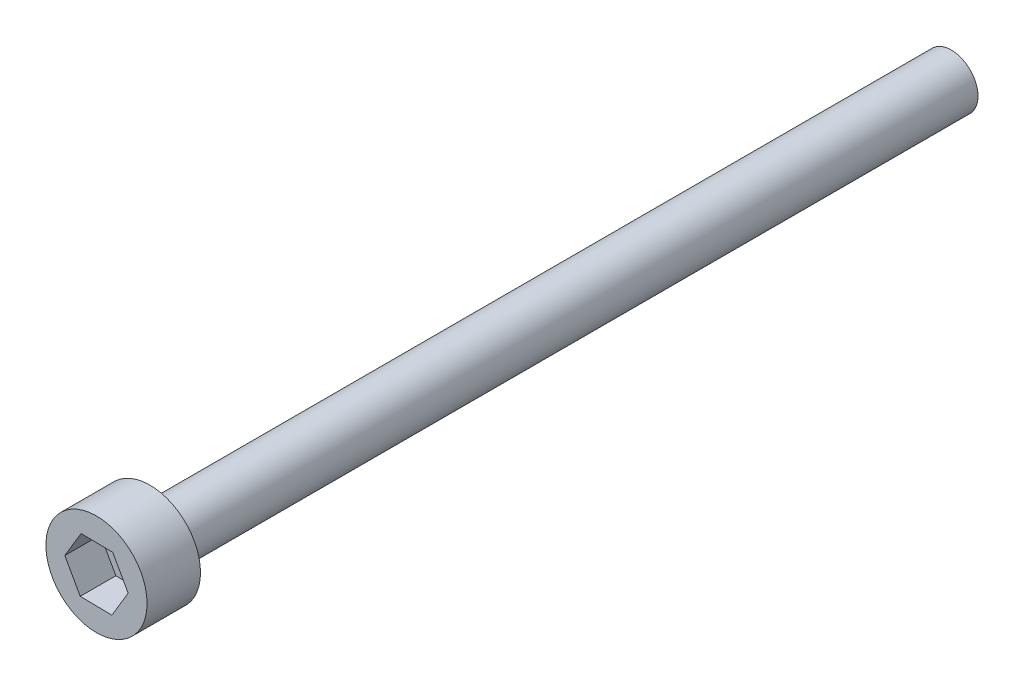
ISO-10303-21;
HEADER;
FILE_DESCRIPTION(('STEP AP214'),'2;1');
FILE_NAME('part.step','',(''),(''),'','','');
FILE_SCHEMA(('AUTOMOTIVE_DESIGN { 1 0 10303 214 1 1 1 1 }'));
ENDSEC;
DATA;
#1=APPLICATION_CONTEXT('core data for automotive mechanical design processes');
#2=APPLICATION_PROTOCOL_DEFINITION('international standard','automotive_design',2000,#1);
#3=PRODUCT_CONTEXT('',#1,'mechanical');
#4=PRODUCT('Part','Part','',(#3));
#5=PRODUCT_RELATED_PRODUCT_CATEGORY('part','',(#4));
#6=PRODUCT_DEFINITION_FORMATION('','',#4);
#7=PRODUCT_DEFINITION_CONTEXT('part definition',#1,'design');
#8=PRODUCT_DEFINITION('design','',#6,#7);
#9=PRODUCT_DEFINITION_SHAPE('','',#8);
#10=(LENGTH_UNIT() NAMED_UNIT(*) SI_UNIT(.MILLI.,.METRE.));
#11=(NAMED_UNIT(*) PLANE_ANGLE_UNIT() SI_UNIT($,.RADIAN.));
#12=(NAMED_UNIT(*) SI_UNIT($,.STERADIAN.) SOLID_ANGLE_UNIT());
#13=UNCERTAINTY_MEASURE_WITH_UNIT(LENGTH_MEASURE(1.E-05),#10,'distance_accuracy_value','');
#14=(GEOMETRIC_REPRESENTATION_CONTEXT(3) GLOBAL_UNCERTAINTY_ASSIGNED_CONTEXT((#13)) GLOBAL_UNIT_ASSIGNED_CONTEXT((#10,
#11,#12)) REPRESENTATION_CONTEXT('',''));
#15=CARTESIAN_POINT('',(0.,0.,0.));
#16=DIRECTION('',(0.,0.,1.));
#17=DIRECTION('',(1.,0.,0.));
#18=AXIS2_PLACEMENT_3D('',#15,#16,#17);
#19=CARTESIAN_POINT('',(0.,0.,3.));
#20=DIRECTION('',(0.,0.,-1.));
#21=DIRECTION('',(-1.,0.,0.));
#22=AXIS2_PLACEMENT_3D('',#19,#20,#21);
#23=CYLINDRICAL_SURFACE('',#22,2.84);
#24=CARTESIAN_POINT('',(0.,0.,3.));
#25=DIRECTION('',(0.,0.,1.));
#26=DIRECTION('',(1.,0.,0.));
#27=AXIS2_PLACEMENT_3D('',#24,#25,#26);
#28=CIRCLE('',#27,2.84);
#29=CARTESIAN_POINT('',(2.84,0.,3.));
#30=VERTEX_POINT('',#29);
#31=EDGE_CURVE('E44',#30,#30,#28,.T.);
#32=ORIENTED_EDGE('',*,*,#31,.F.);
#33=EDGE_LOOP('',(#32));
#34=FACE_BOUND('',#33,.T.);
#35=CARTESIAN_POINT('',(0.,0.,0.));
#36=DIRECTION('',(0.,0.,1.));
#37=DIRECTION('',(1.,0.,0.));
#38=AXIS2_PLACEMENT_3D('',#35,#36,#37);
#39=CIRCLE('',#38,2.84);
#40=CARTESIAN_POINT('',(2.84,0.,0.));
#41=VERTEX_POINT('',#40);
#42=EDGE_CURVE('E146',#41,#41,#39,.T.);
#43=ORIENTED_EDGE('',*,*,#42,.T.);
#44=EDGE_LOOP('',(#43));
#45=FACE_BOUND('',#44,.T.);
#46=ADVANCED_FACE('F37',(#34,#45),#23,.T.);
#47=CARTESIAN_POINT('',(0.,0.,3.));
#48=DIRECTION('',(0.,0.,1.));
#49=DIRECTION('',(1.,0.,0.));
#50=AXIS2_PLACEMENT_3D('',#47,#48,#49);
#51=PLANE('',#50);
#52=DIRECTION('',(-0.486688945822522,0.873575337343129,0.));
#53=VECTOR('',#52,1.);
#54=CARTESIAN_POINT('',(1.77803061008708,-0.027211815938925,3.));
#55=LINE('',#54,#53);
#56=CARTESIAN_POINT('',(1.77803061008708,-0.027211815938925,3.));
#57=VERTEX_POINT('',#56);
#58=CARTESIAN_POINT('',(0.912581428929756,1.52621376907229,3.));
#59=VERTEX_POINT('',#58);
#60=EDGE_CURVE('E51',#57,#59,#55,.T.);
#61=ORIENTED_EDGE('',*,*,#60,.F.);
#62=DIRECTION('',(0.513193961347449,0.858272659494937,0.));
#63=VECTOR('',#62,1.);
#64=CARTESIAN_POINT('',(0.865449181157325,-1.55342558501122,3.));
#65=LINE('',#64,#63);
#66=CARTESIAN_POINT('',(0.865449181157325,-1.55342558501122,3.));
#67=VERTEX_POINT('',#66);
#68=EDGE_CURVE('E134',#67,#57,#65,.T.);
#69=ORIENTED_EDGE('',*,*,#68,.F.);
#70=DIRECTION('',(0.999882907169972,-0.0153026778481919,0.));
#71=VECTOR('',#70,1.);
#72=CARTESIAN_POINT('',(-0.912581428929756,-1.52621376907229,3.));
#73=LINE('',#72,#71);
#74=CARTESIAN_POINT('',(-0.912581428929756,-1.52621376907229,3.));
#75=VERTEX_POINT('',#74);
#76=EDGE_CURVE('E132',#75,#67,#73,.T.);
#77=ORIENTED_EDGE('',*,*,#76,.F.);
#78=DIRECTION('',(0.486688945822522,-0.873575337343129,0.));
#79=VECTOR('',#78,1.);
#80=CARTESIAN_POINT('',(-1.77803061008708,0.0272118159389248,3.));
#81=LINE('',#80,#79);
#82=CARTESIAN_POINT('',(-1.77803061008708,0.0272118159389248,3.));
#83=VERTEX_POINT('',#82);
#84=EDGE_CURVE('E99',#83,#75,#81,.T.);
#85=ORIENTED_EDGE('',*,*,#84,.F.);
#86=DIRECTION('',(-0.513193961347449,-0.858272659494938,0.));
#87=VECTOR('',#86,1.);
#88=CARTESIAN_POINT('',(-0.865449181157325,1.55342558501122,3.));
#89=LINE('',#88,#87);
#90=CARTESIAN_POINT('',(-0.865449181157325,1.55342558501122,3.));
#91=VERTEX_POINT('',#90);
#92=EDGE_CURVE('E128',#91,#83,#89,.T.);
#93=ORIENTED_EDGE('',*,*,#92,.F.);
#94=DIRECTION('',(-0.999882907169972,0.0153026778481919,0.));
#95=VECTOR('',#94,1.);
#96=CARTESIAN_POINT('',(0.912581428929756,1.52621376907229,3.));
#97=LINE('',#96,#95);
#98=EDGE_CURVE('E125',#59,#91,#97,.T.);
#99=ORIENTED_EDGE('',*,*,#98,.F.);
#100=EDGE_LOOP('',(#61,#69,#77,#85,#93,#99));
#101=FACE_BOUND('',#100,.T.);
#102=ORIENTED_EDGE('',*,*,#31,.T.);
#103=EDGE_LOOP('',(#102));
#104=FACE_BOUND('',#103,.T.);
#105=ADVANCED_FACE('F155',(#101,#104),#51,.T.);
#106=CARTESIAN_POINT('',(0.,0.,0.));
#107=DIRECTION('',(0.,0.,1.));
#108=DIRECTION('',(1.,0.,0.));
#109=AXIS2_PLACEMENT_3D('',#106,#107,#108);
#110=PLANE('',#109);
#111=CARTESIAN_POINT('',(0.,0.,0.));
#112=DIRECTION('',(0.,0.,1.));
#113=DIRECTION('',(1.,0.,0.));
#114=AXIS2_PLACEMENT_3D('',#111,#112,#113);
#115=CIRCLE('',#114,1.5);
#116=CARTESIAN_POINT('',(1.5,0.,0.));
#117=VERTEX_POINT('',#116);
#118=EDGE_CURVE('E11',#117,#117,#115,.F.);
#119=ORIENTED_EDGE('',*,*,#118,.F.);
#120=EDGE_LOOP('',(#119));
#121=FACE_BOUND('',#120,.T.);
#122=ORIENTED_EDGE('',*,*,#42,.F.);
#123=EDGE_LOOP('',(#122));
#124=FACE_BOUND('',#123,.T.);
#125=ADVANCED_FACE('F152',(#121,#124),#110,.F.);
#126=CARTESIAN_POINT('',(0.,0.,-45.));
#127=DIRECTION('',(0.,0.,1.));
#128=DIRECTION('',(1.,0.,0.));
#129=AXIS2_PLACEMENT_3D('',#126,#127,#128);
#130=CYLINDRICAL_SURFACE('',#129,1.5);
#131=CARTESIAN_POINT('',(0.,0.,-45.));
#132=DIRECTION('',(0.,0.,-1.));
#133=DIRECTION('',(-1.,0.,0.));
#134=AXIS2_PLACEMENT_3D('',#131,#132,#133);
#135=CIRCLE('',#134,1.5);
#136=CARTESIAN_POINT('',(1.5,0.,-45.));
#137=VERTEX_POINT('',#136);
#138=EDGE_CURVE('E138',#137,#137,#135,.T.);
#139=CARTESIAN_POINT('',(1.5,0.,-45.));
#140=CARTESIAN_POINT('',(1.5,0.,-44.53125));
#141=CARTESIAN_POINT('',(1.5,0.,-44.0625));
#142=CARTESIAN_POINT('',(1.5,0.,-43.125));
#143=CARTESIAN_POINT('',(1.5,0.,-42.65625));
#144=CARTESIAN_POINT('',(1.5,0.,-41.71875));
#145=CARTESIAN_POINT('',(1.5,0.,-41.25));
#146=CARTESIAN_POINT('',(1.5,0.,-40.3125));
#147=CARTESIAN_POINT('',(1.5,0.,-39.84375));
#148=CARTESIAN_POINT('',(1.5,0.,-38.90625));
#149=CARTESIAN_POINT('',(1.5,0.,-38.4375));
#150=CARTESIAN_POINT('',(1.5,0.,-37.5));
#151=CARTESIAN_POINT('',(1.5,0.,-37.03125));
#152=CARTESIAN_POINT('',(1.5,0.,-36.09375));
#153=CARTESIAN_POINT('',(1.5,0.,-35.625));
#154=CARTESIAN_POINT('',(1.5,0.,-34.6875));
#155=CARTESIAN_POINT('',(1.5,0.,-34.21875));
#156=CARTESIAN_POINT('',(1.5,0.,-33.28125));
#157=CARTESIAN_POINT('',(1.5,0.,-32.8125));
#158=CARTESIAN_POINT('',(1.5,0.,-31.875));
#159=CARTESIAN_POINT('',(1.5,0.,-31.40625));
#160=CARTESIAN_POINT('',(1.5,0.,-30.46875));
#161=CARTESIAN_POINT('',(1.5,0.,-30.));
#162=CARTESIAN_POINT('',(1.5,0.,-29.0625));
#163=CARTESIAN_POINT('',(1.5,0.,-28.59375));
#164=CARTESIAN_POINT('',(1.5,0.,-27.65625));
#165=CARTESIAN_POINT('',(1.5,0.,-27.1875));
#166=CARTESIAN_POINT('',(1.5,0.,-26.25));
#167=CARTESIAN_POINT('',(1.5,0.,-25.78125));
#168=CARTESIAN_POINT('',(1.5,0.,-24.84375));
#169=CARTESIAN_POINT('',(1.5,0.,-24.375));
#170=CARTESIAN_POINT('',(1.5,0.,-23.4375));
#171=CARTESIAN_POINT('',(1.5,0.,-22.96875));
#172=CARTESIAN_POINT('',(1.5,0.,-22.03125));
#173=CARTESIAN_POINT('',(1.5,0.,-21.5625));
#174=CARTESIAN_POINT('',(1.5,0.,-20.625));
#175=CARTESIAN_POINT('',(1.5,0.,-20.15625));
#176=CARTESIAN_POINT('',(1.5,0.,-19.21875));
#177=CARTESIAN_POINT('',(1.5,0.,-18.75));
#178=CARTESIAN_POINT('',(1.5,0.,-17.8125));
#179=CARTESIAN_POINT('',(1.5,0.,-17.34375));
#180=CARTESIAN_POINT('',(1.5,0.,-16.40625));
#181=CARTESIAN_POINT('',(1.5,0.,-15.9375));
#182=CARTESIAN_POINT('',(1.5,0.,-15.));
#183=CARTESIAN_POINT('',(1.5,0.,-14.53125));
#184=CARTESIAN_POINT('',(1.5,0.,-13.59375));
#185=CARTESIAN_POINT('',(1.5,0.,-13.125));
#186=CARTESIAN_POINT('',(1.5,0.,-12.1875));
#187=CARTESIAN_POINT('',(1.5,0.,-11.71875));
#188=CARTESIAN_POINT('',(1.5,0.,-10.78125));
#189=CARTESIAN_POINT('',(1.5,0.,-10.3125));
#190=CARTESIAN_POINT('',(1.5,0.,-9.37500000000001));
#191=CARTESIAN_POINT('',(1.5,0.,-8.90625000000001));
#192=CARTESIAN_POINT('',(1.5,0.,-7.96875000000001));
#193=CARTESIAN_POINT('',(1.5,0.,-7.5));
#194=CARTESIAN_POINT('',(1.5,0.,-6.5625));
#195=CARTESIAN_POINT('',(1.5,0.,-6.09375));
#196=CARTESIAN_POINT('',(1.5,0.,-5.15625000000001));
#197=CARTESIAN_POINT('',(1.5,0.,-4.68750000000001));
#198=CARTESIAN_POINT('',(1.5,0.,-3.75000000000001));
#199=CARTESIAN_POINT('',(1.5,0.,-3.28125000000001));
#200=CARTESIAN_POINT('',(1.5,0.,-2.34375000000001));
#201=CARTESIAN_POINT('',(1.5,0.,-1.87500000000001));
#202=CARTESIAN_POINT('',(1.5,0.,-0.937500000000006));
#203=CARTESIAN_POINT('',(1.5,0.,-0.468750000000007));
#204=CARTESIAN_POINT('',(1.5,0.,0.));
#205=B_SPLINE_CURVE_WITH_KNOTS('',3,(#139,#140,#141,#142,#143,#144,#145,#146,#147,#148,#149,
#150,#151,#152,#153,#154,#155,#156,#157,#158,#159,#160,#161,#162,#163,#164,#165,#166,#167,#168,
#169,#170,#171,#172,#173,#174,#175,#176,#177,#178,#179,#180,#181,#182,#183,#184,#185,#186,#187,
#188,#189,#190,#191,#192,#193,#194,#195,#196,#197,#198,#199,#200,#201,#202,#203,#204),
.UNSPECIFIED.,.F.,.F.,(4,2,2,2,2,2,2,2,2,2,2,2,2,2,2,2,2,2,2,2,2,2,2,2,2,2,2,2,2,2,2,2,4),(0.,
1.40625,2.8125,4.21874999999999,5.625,7.03125,8.43749999999999,9.84374999999999,11.25,12.65625,
14.0625,15.46875,16.875,18.28125,19.6875,21.09375,22.5,23.90625,25.3125,26.71875,28.125,
29.53125,30.9375,32.34375,33.75,35.15625,36.5625,37.96875,39.375,40.78125,42.1875,43.59375,45.),.UNSPECIFIED.);
#206=EDGE_CURVE('BSEAM154',#137,#117,#205,.T.);
#207=ORIENTED_EDGE('',*,*,#138,.F.);
#208=ORIENTED_EDGE('',*,*,#118,.T.);
#209=ORIENTED_EDGE('',*,*,#206,.T.);
#210=ORIENTED_EDGE('',*,*,#206,.F.);
#211=EDGE_LOOP('',(#207,#209,#208,#210));
#212=FACE_BOUND('',#211,.T.);
#213=ADVANCED_FACE('F154',(#212),#130,.T.);
#214=CARTESIAN_POINT('',(0.,0.,-45.));
#215=DIRECTION('',(0.,0.,-1.));
#216=DIRECTION('',(-1.,0.,0.));
#217=AXIS2_PLACEMENT_3D('',#214,#215,#216);
#218=PLANE('',#217);
#219=ORIENTED_EDGE('',*,*,#138,.T.);
#220=EDGE_LOOP('',(#219));
#221=FACE_BOUND('',#220,.T.);
#222=ADVANCED_FACE('F161',(#221),#218,.T.);
#223=CARTESIAN_POINT('',(1.77803061008708,-0.027211815938925,1.));
#224=DIRECTION('',(0.873575337343129,0.486688945822522,0.));
#225=DIRECTION('',(-0.486688945822522,0.873575337343129,0.));
#226=AXIS2_PLACEMENT_3D('',#223,#224,#225);
#227=PLANE('',#226);
#228=ORIENTED_EDGE('',*,*,#60,.T.);
#229=DIRECTION('',(0.,0.,1.));
#230=VECTOR('',#229,1.);
#231=CARTESIAN_POINT('',(0.912581428929756,1.52621376907229,1.));
#232=LINE('',#231,#230);
#233=CARTESIAN_POINT('',(0.912581428929756,1.52621376907229,1.));
#234=VERTEX_POINT('',#233);
#235=EDGE_CURVE('E81',#234,#59,#232,.T.);
#236=ORIENTED_EDGE('',*,*,#235,.F.);
#237=DIRECTION('',(-0.486688945822522,0.873575337343129,0.));
#238=VECTOR('',#237,1.);
#239=CARTESIAN_POINT('',(1.77803061008708,-0.027211815938925,1.));
#240=LINE('',#239,#238);
#241=CARTESIAN_POINT('',(1.77803061008708,-0.027211815938925,1.));
#242=VERTEX_POINT('',#241);
#243=EDGE_CURVE('E136',#242,#234,#240,.T.);
#244=ORIENTED_EDGE('',*,*,#243,.F.);
#245=DIRECTION('',(0.,0.,1.));
#246=VECTOR('',#245,1.);
#247=CARTESIAN_POINT('',(1.77803061008708,-0.027211815938925,1.));
#248=LINE('',#247,#246);
#249=EDGE_CURVE('E59',#242,#57,#248,.T.);
#250=ORIENTED_EDGE('',*,*,#249,.T.);
#251=EDGE_LOOP('',(#228,#236,#244,#250));
#252=FACE_BOUND('',#251,.T.);
#253=ADVANCED_FACE('F188',(#252),#227,.F.);
#254=CARTESIAN_POINT('',(0.865449181157325,-1.55342558501122,1.));
#255=DIRECTION('',(0.858272659494937,-0.513193961347449,0.));
#256=DIRECTION('',(0.513193961347449,0.858272659494937,0.));
#257=AXIS2_PLACEMENT_3D('',#254,#255,#256);
#258=PLANE('',#257);
#259=ORIENTED_EDGE('',*,*,#68,.T.);
#260=ORIENTED_EDGE('',*,*,#249,.F.);
#261=DIRECTION('',(0.513193961347449,0.858272659494937,0.));
#262=VECTOR('',#261,1.);
#263=CARTESIAN_POINT('',(0.865449181157325,-1.55342558501122,1.));
#264=LINE('',#263,#262);
#265=CARTESIAN_POINT('',(0.865449181157325,-1.55342558501122,1.));
#266=VERTEX_POINT('',#265);
#267=EDGE_CURVE('E111',#266,#242,#264,.T.);
#268=ORIENTED_EDGE('',*,*,#267,.F.);
#269=DIRECTION('',(0.,0.,1.));
#270=VECTOR('',#269,1.);
#271=CARTESIAN_POINT('',(0.865449181157325,-1.55342558501122,1.));
#272=LINE('',#271,#270);
#273=EDGE_CURVE('E103',#266,#67,#272,.T.);
#274=ORIENTED_EDGE('',*,*,#273,.T.);
#275=EDGE_LOOP('',(#259,#260,#268,#274));
#276=FACE_BOUND('',#275,.T.);
#277=ADVANCED_FACE('F193',(#276),#258,.F.);
#278=CARTESIAN_POINT('',(-0.912581428929756,-1.52621376907229,1.));
#279=DIRECTION('',(-0.0153026778481919,-0.999882907169972,0.));
#280=DIRECTION('',(0.999882907169972,-0.0153026778481919,0.));
#281=AXIS2_PLACEMENT_3D('',#278,#279,#280);
#282=PLANE('',#281);
#283=ORIENTED_EDGE('',*,*,#76,.T.);
#284=ORIENTED_EDGE('',*,*,#273,.F.);
#285=DIRECTION('',(0.999882907169972,-0.0153026778481919,0.));
#286=VECTOR('',#285,1.);
#287=CARTESIAN_POINT('',(-0.912581428929756,-1.52621376907229,1.));
#288=LINE('',#287,#286);
#289=CARTESIAN_POINT('',(-0.912581428929756,-1.52621376907229,1.));
#290=VERTEX_POINT('',#289);
#291=EDGE_CURVE('E107',#290,#266,#288,.T.);
#292=ORIENTED_EDGE('',*,*,#291,.F.);
#293=DIRECTION('',(0.,0.,1.));
#294=VECTOR('',#293,1.);
#295=CARTESIAN_POINT('',(-0.912581428929756,-1.52621376907229,1.));
#296=LINE('',#295,#294);
#297=EDGE_CURVE('E92',#290,#75,#296,.T.);
#298=ORIENTED_EDGE('',*,*,#297,.T.);
#299=EDGE_LOOP('',(#283,#284,#292,#298));
#300=FACE_BOUND('',#299,.T.);
#301=ADVANCED_FACE('F108',(#300),#282,.F.);
#302=CARTESIAN_POINT('',(-1.77803061008708,0.0272118159389248,1.));
#303=DIRECTION('',(-0.873575337343129,-0.486688945822522,0.));
#304=DIRECTION('',(0.486688945822522,-0.873575337343129,0.));
#305=AXIS2_PLACEMENT_3D('',#302,#303,#304);
#306=PLANE('',#305);
#307=ORIENTED_EDGE('',*,*,#84,.T.);
#308=ORIENTED_EDGE('',*,*,#297,.F.);
#309=DIRECTION('',(0.486688945822522,-0.873575337343129,0.));
#310=VECTOR('',#309,1.);
#311=CARTESIAN_POINT('',(-1.77803061008708,0.0272118159389248,1.));
#312=LINE('',#311,#310);
#313=CARTESIAN_POINT('',(-1.77803061008708,0.0272118159389248,1.));
#314=VERTEX_POINT('',#313);
#315=EDGE_CURVE('E96',#314,#290,#312,.T.);
#316=ORIENTED_EDGE('',*,*,#315,.F.);
#317=DIRECTION('',(0.,0.,1.));
#318=VECTOR('',#317,1.);
#319=CARTESIAN_POINT('',(-1.77803061008708,0.0272118159389248,1.));
#320=LINE('',#319,#318);
#321=EDGE_CURVE('E104',#314,#83,#320,.T.);
#322=ORIENTED_EDGE('',*,*,#321,.T.);
#323=EDGE_LOOP('',(#307,#308,#316,#322));
#324=FACE_BOUND('',#323,.T.);
#325=ADVANCED_FACE('F94',(#324),#306,.F.);
#326=CARTESIAN_POINT('',(-0.865449181157325,1.55342558501122,1.));
#327=DIRECTION('',(-0.858272659494937,0.513193961347449,0.));
#328=DIRECTION('',(-0.513193961347449,-0.858272659494938,0.));
#329=AXIS2_PLACEMENT_3D('',#326,#327,#328);
#330=PLANE('',#329);
#331=ORIENTED_EDGE('',*,*,#92,.T.);
#332=ORIENTED_EDGE('',*,*,#321,.F.);
#333=DIRECTION('',(-0.513193961347449,-0.858272659494938,0.));
#334=VECTOR('',#333,1.);
#335=CARTESIAN_POINT('',(-0.865449181157325,1.55342558501122,1.));
#336=LINE('',#335,#334);
#337=CARTESIAN_POINT('',(-0.865449181157325,1.55342558501122,1.));
#338=VERTEX_POINT('',#337);
#339=EDGE_CURVE('E117',#338,#314,#336,.T.);
#340=ORIENTED_EDGE('',*,*,#339,.F.);
#341=DIRECTION('',(0.,0.,1.));
#342=VECTOR('',#341,1.);
#343=CARTESIAN_POINT('',(-0.865449181157325,1.55342558501122,1.));
#344=LINE('',#343,#342);
#345=EDGE_CURVE('E141',#338,#91,#344,.T.);
#346=ORIENTED_EDGE('',*,*,#345,.T.);
#347=EDGE_LOOP('',(#331,#332,#340,#346));
#348=FACE_BOUND('',#347,.T.);
#349=ADVANCED_FACE('F218',(#348),#330,.F.);
#350=CARTESIAN_POINT('',(0.912581428929756,1.52621376907229,1.));
#351=DIRECTION('',(0.0153026778481919,0.999882907169972,0.));
#352=DIRECTION('',(-0.999882907169972,0.0153026778481919,0.));
#353=AXIS2_PLACEMENT_3D('',#350,#351,#352);
#354=PLANE('',#353);
#355=ORIENTED_EDGE('',*,*,#98,.T.);
#356=ORIENTED_EDGE('',*,*,#345,.F.);
#357=DIRECTION('',(-0.999882907169972,0.0153026778481919,0.));
#358=VECTOR('',#357,1.);
#359=CARTESIAN_POINT('',(0.912581428929756,1.52621376907229,1.));
#360=LINE('',#359,#358);
#361=EDGE_CURVE('E119',#234,#338,#360,.T.);
#362=ORIENTED_EDGE('',*,*,#361,.F.);
#363=ORIENTED_EDGE('',*,*,#235,.T.);
#364=EDGE_LOOP('',(#355,#356,#362,#363));
#365=FACE_BOUND('',#364,.T.);
#366=ADVANCED_FACE('F227',(#365),#354,.F.);
#367=CARTESIAN_POINT('',(0.,0.,1.));
#368=DIRECTION('',(0.,0.,1.));
#369=DIRECTION('',(1.,0.,0.));
#370=AXIS2_PLACEMENT_3D('',#367,#368,#369);
#371=PLANE('',#370);
#372=ORIENTED_EDGE('',*,*,#243,.T.);
#373=ORIENTED_EDGE('',*,*,#361,.T.);
#374=ORIENTED_EDGE('',*,*,#339,.T.);
#375=ORIENTED_EDGE('',*,*,#315,.T.);
#376=ORIENTED_EDGE('',*,*,#291,.T.);
#377=ORIENTED_EDGE('',*,*,#267,.T.);
#378=EDGE_LOOP('',(#372,#373,#374,#375,#376,#377));
#379=FACE_BOUND('',#378,.T.);
#380=ADVANCED_FACE('F114',(#379),#371,.T.);
#381=CLOSED_SHELL('',(#46,#105,#125,#213,#222,#253,#277,#301,#325,#349,#366,#380));
#382=MANIFOLD_SOLID_BREP('B2',#381);
#383=ADVANCED_BREP_SHAPE_REPRESENTATION('',(#18,#382),#14);
#384=SHAPE_DEFINITION_REPRESENTATION(#9,#383);
ENDSEC;
END-ISO-10303-21;
